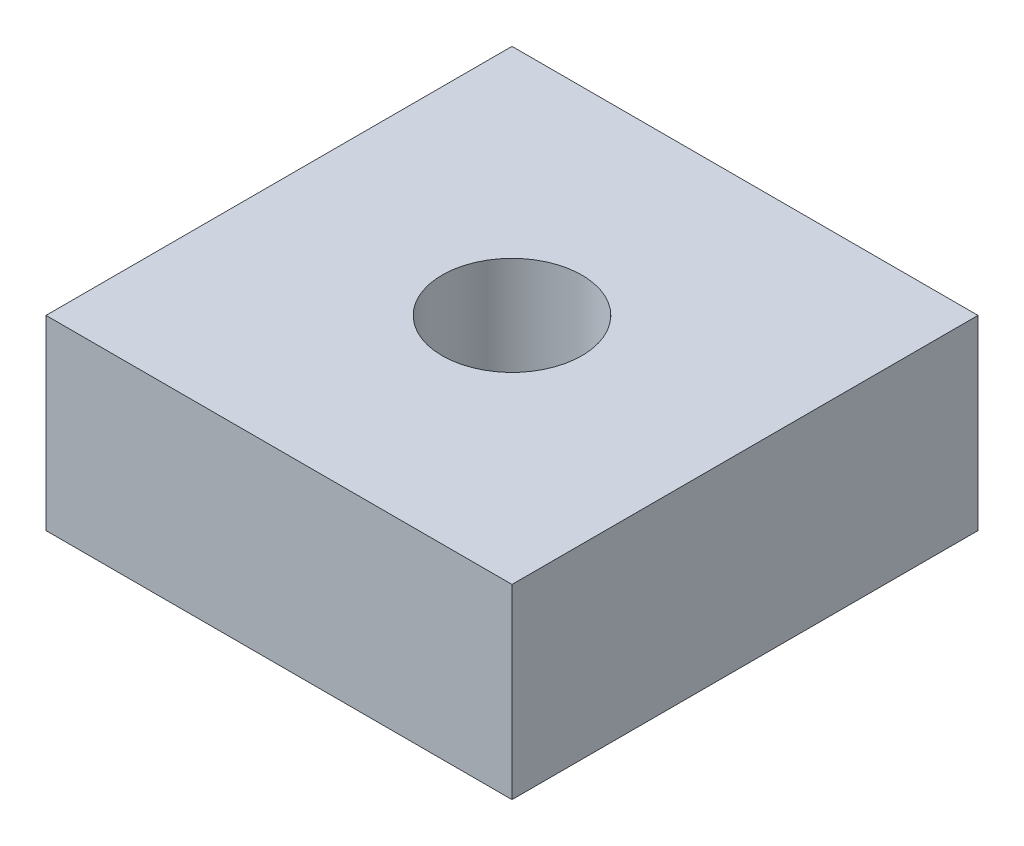
ISO-10303-21;
HEADER;
FILE_DESCRIPTION(('STEP AP214'),'2;1');
FILE_NAME('part.step','',(''),(''),'','','');
FILE_SCHEMA(('AUTOMOTIVE_DESIGN { 1 0 10303 214 1 1 1 1 }'));
ENDSEC;
DATA;
#1=APPLICATION_CONTEXT('core data for automotive mechanical design processes');
#2=APPLICATION_PROTOCOL_DEFINITION('international standard','automotive_design',2000,#1);
#3=PRODUCT_CONTEXT('',#1,'mechanical');
#4=PRODUCT('Part','Part','',(#3));
#5=PRODUCT_RELATED_PRODUCT_CATEGORY('part','',(#4));
#6=PRODUCT_DEFINITION_FORMATION('','',#4);
#7=PRODUCT_DEFINITION_CONTEXT('part definition',#1,'design');
#8=PRODUCT_DEFINITION('design','',#6,#7);
#9=PRODUCT_DEFINITION_SHAPE('','',#8);
#10=(LENGTH_UNIT() NAMED_UNIT(*) SI_UNIT(.MILLI.,.METRE.));
#11=(NAMED_UNIT(*) PLANE_ANGLE_UNIT() SI_UNIT($,.RADIAN.));
#12=(NAMED_UNIT(*) SI_UNIT($,.STERADIAN.) SOLID_ANGLE_UNIT());
#13=UNCERTAINTY_MEASURE_WITH_UNIT(LENGTH_MEASURE(1.E-05),#10,'distance_accuracy_value','');
#14=(GEOMETRIC_REPRESENTATION_CONTEXT(3) GLOBAL_UNCERTAINTY_ASSIGNED_CONTEXT((#13)) GLOBAL_UNIT_ASSIGNED_CONTEXT((#10,
#11,#12)) REPRESENTATION_CONTEXT('',''));
#15=CARTESIAN_POINT('',(0.,0.,0.));
#16=DIRECTION('',(0.,0.,1.));
#17=DIRECTION('',(1.,0.,0.));
#18=AXIS2_PLACEMENT_3D('',#15,#16,#17);
#19=CARTESIAN_POINT('',(0.,10.,0.));
#20=DIRECTION('',(0.,-1.,0.));
#21=DIRECTION('',(0.,0.,-1.));
#22=AXIS2_PLACEMENT_3D('',#19,#20,#21);
#23=PLANE('',#22);
#24=DIRECTION('',(0.,0.,-1.));
#25=VECTOR('',#24,1.);
#26=CARTESIAN_POINT('',(25.,10.,25.));
#27=LINE('',#26,#25);
#28=CARTESIAN_POINT('',(25.,10.,25.));
#29=VERTEX_POINT('',#28);
#30=CARTESIAN_POINT('',(25.,10.,-25.));
#31=VERTEX_POINT('',#30);
#32=EDGE_CURVE('E93',#29,#31,#27,.T.);
#33=ORIENTED_EDGE('',*,*,#32,.T.);
#34=DIRECTION('',(-1.,0.,0.));
#35=VECTOR('',#34,1.);
#36=CARTESIAN_POINT('',(-25.,10.,-25.));
#37=LINE('',#36,#35);
#38=CARTESIAN_POINT('',(-25.,10.,-25.));
#39=VERTEX_POINT('',#38);
#40=EDGE_CURVE('E88',#31,#39,#37,.T.);
#41=ORIENTED_EDGE('',*,*,#40,.T.);
#42=DIRECTION('',(0.,0.,1.));
#43=VECTOR('',#42,1.);
#44=CARTESIAN_POINT('',(-25.,10.,25.));
#45=LINE('',#44,#43);
#46=CARTESIAN_POINT('',(-25.,10.,25.));
#47=VERTEX_POINT('',#46);
#48=EDGE_CURVE('E91',#39,#47,#45,.T.);
#49=ORIENTED_EDGE('',*,*,#48,.T.);
#50=DIRECTION('',(1.,0.,0.));
#51=VECTOR('',#50,1.);
#52=CARTESIAN_POINT('',(-25.,10.,25.));
#53=LINE('',#52,#51);
#54=EDGE_CURVE('E58',#47,#29,#53,.T.);
#55=ORIENTED_EDGE('',*,*,#54,.T.);
#56=EDGE_LOOP('',(#33,#41,#49,#55));
#57=FACE_BOUND('',#56,.T.);
#58=CARTESIAN_POINT('',(0.,10.,0.));
#59=DIRECTION('',(0.,1.,0.));
#60=DIRECTION('',(0.,0.,1.));
#61=AXIS2_PLACEMENT_3D('',#58,#59,#60);
#62=CIRCLE('',#61,7.5);
#63=CARTESIAN_POINT('',(0.,10.,7.5));
#64=VERTEX_POINT('',#63);
#65=EDGE_CURVE('E108',#64,#64,#62,.T.);
#66=ORIENTED_EDGE('',*,*,#65,.F.);
#67=EDGE_LOOP('',(#66));
#68=FACE_BOUND('',#67,.T.);
#69=ADVANCED_FACE('F41',(#57,#68),#23,.F.);
#70=CARTESIAN_POINT('',(0.,-10.,0.));
#71=DIRECTION('',(0.,-1.,0.));
#72=DIRECTION('',(0.,0.,-1.));
#73=AXIS2_PLACEMENT_3D('',#70,#71,#72);
#74=PLANE('',#73);
#75=DIRECTION('',(0.,0.,-1.));
#76=VECTOR('',#75,1.);
#77=CARTESIAN_POINT('',(25.,-10.,25.));
#78=LINE('',#77,#76);
#79=CARTESIAN_POINT('',(25.,-10.,25.));
#80=VERTEX_POINT('',#79);
#81=CARTESIAN_POINT('',(25.,-10.,-25.));
#82=VERTEX_POINT('',#81);
#83=EDGE_CURVE('E105',#80,#82,#78,.T.);
#84=ORIENTED_EDGE('',*,*,#83,.F.);
#85=DIRECTION('',(1.,0.,0.));
#86=VECTOR('',#85,1.);
#87=CARTESIAN_POINT('',(-25.,-10.,25.));
#88=LINE('',#87,#86);
#89=CARTESIAN_POINT('',(-25.,-10.,25.));
#90=VERTEX_POINT('',#89);
#91=EDGE_CURVE('E81',#90,#80,#88,.T.);
#92=ORIENTED_EDGE('',*,*,#91,.F.);
#93=DIRECTION('',(0.,0.,1.));
#94=VECTOR('',#93,1.);
#95=CARTESIAN_POINT('',(-25.,-10.,25.));
#96=LINE('',#95,#94);
#97=CARTESIAN_POINT('',(-25.,-10.,-25.));
#98=VERTEX_POINT('',#97);
#99=EDGE_CURVE('E75',#98,#90,#96,.T.);
#100=ORIENTED_EDGE('',*,*,#99,.F.);
#101=DIRECTION('',(-1.,0.,0.));
#102=VECTOR('',#101,1.);
#103=CARTESIAN_POINT('',(-25.,-10.,-25.));
#104=LINE('',#103,#102);
#105=EDGE_CURVE('E97',#82,#98,#104,.T.);
#106=ORIENTED_EDGE('',*,*,#105,.F.);
#107=EDGE_LOOP('',(#84,#92,#100,#106));
#108=FACE_BOUND('',#107,.T.);
#109=CARTESIAN_POINT('',(0.,-10.,0.));
#110=DIRECTION('',(0.,1.,0.));
#111=DIRECTION('',(0.,0.,1.));
#112=AXIS2_PLACEMENT_3D('',#109,#110,#111);
#113=CIRCLE('',#112,7.5);
#114=CARTESIAN_POINT('',(0.,-10.,7.5));
#115=VERTEX_POINT('',#114);
#116=EDGE_CURVE('E120',#115,#115,#113,.T.);
#117=ORIENTED_EDGE('',*,*,#116,.T.);
#118=EDGE_LOOP('',(#117));
#119=FACE_BOUND('',#118,.T.);
#120=ADVANCED_FACE('F116',(#108,#119),#74,.T.);
#121=CARTESIAN_POINT('',(25.,10.,25.));
#122=DIRECTION('',(-1.,0.,0.));
#123=DIRECTION('',(0.,0.,1.));
#124=AXIS2_PLACEMENT_3D('',#121,#122,#123);
#125=PLANE('',#124);
#126=ORIENTED_EDGE('',*,*,#83,.T.);
#127=DIRECTION('',(0.,-1.,0.));
#128=VECTOR('',#127,1.);
#129=CARTESIAN_POINT('',(25.,10.,-25.));
#130=LINE('',#129,#128);
#131=EDGE_CURVE('E11',#31,#82,#130,.T.);
#132=ORIENTED_EDGE('',*,*,#131,.F.);
#133=ORIENTED_EDGE('',*,*,#32,.F.);
#134=DIRECTION('',(0.,-1.,0.));
#135=VECTOR('',#134,1.);
#136=CARTESIAN_POINT('',(25.,10.,25.));
#137=LINE('',#136,#135);
#138=EDGE_CURVE('E101',#29,#80,#137,.T.);
#139=ORIENTED_EDGE('',*,*,#138,.T.);
#140=EDGE_LOOP('',(#126,#132,#133,#139));
#141=FACE_BOUND('',#140,.T.);
#142=ADVANCED_FACE('F43',(#141),#125,.F.);
#143=CARTESIAN_POINT('',(-25.,10.,-25.));
#144=DIRECTION('',(0.,0.,1.));
#145=DIRECTION('',(1.,0.,0.));
#146=AXIS2_PLACEMENT_3D('',#143,#144,#145);
#147=PLANE('',#146);
#148=ORIENTED_EDGE('',*,*,#105,.T.);
#149=DIRECTION('',(0.,-1.,0.));
#150=VECTOR('',#149,1.);
#151=CARTESIAN_POINT('',(-25.,10.,-25.));
#152=LINE('',#151,#150);
#153=EDGE_CURVE('E50',#39,#98,#152,.T.);
#154=ORIENTED_EDGE('',*,*,#153,.F.);
#155=ORIENTED_EDGE('',*,*,#40,.F.);
#156=ORIENTED_EDGE('',*,*,#131,.T.);
#157=EDGE_LOOP('',(#148,#154,#155,#156));
#158=FACE_BOUND('',#157,.T.);
#159=ADVANCED_FACE('F96',(#158),#147,.F.);
#160=CARTESIAN_POINT('',(-25.,10.,25.));
#161=DIRECTION('',(1.,0.,0.));
#162=DIRECTION('',(0.,0.,-1.));
#163=AXIS2_PLACEMENT_3D('',#160,#161,#162);
#164=PLANE('',#163);
#165=ORIENTED_EDGE('',*,*,#99,.T.);
#166=DIRECTION('',(0.,-1.,0.));
#167=VECTOR('',#166,1.);
#168=CARTESIAN_POINT('',(-25.,10.,25.));
#169=LINE('',#168,#167);
#170=EDGE_CURVE('E98',#47,#90,#169,.T.);
#171=ORIENTED_EDGE('',*,*,#170,.F.);
#172=ORIENTED_EDGE('',*,*,#48,.F.);
#173=ORIENTED_EDGE('',*,*,#153,.T.);
#174=EDGE_LOOP('',(#165,#171,#172,#173));
#175=FACE_BOUND('',#174,.T.);
#176=ADVANCED_FACE('F99',(#175),#164,.F.);
#177=CARTESIAN_POINT('',(-25.,10.,25.));
#178=DIRECTION('',(0.,0.,-1.));
#179=DIRECTION('',(-1.,0.,0.));
#180=AXIS2_PLACEMENT_3D('',#177,#178,#179);
#181=PLANE('',#180);
#182=ORIENTED_EDGE('',*,*,#91,.T.);
#183=ORIENTED_EDGE('',*,*,#138,.F.);
#184=ORIENTED_EDGE('',*,*,#54,.F.);
#185=ORIENTED_EDGE('',*,*,#170,.T.);
#186=EDGE_LOOP('',(#182,#183,#184,#185));
#187=FACE_BOUND('',#186,.T.);
#188=ADVANCED_FACE('F113',(#187),#181,.F.);
#189=CARTESIAN_POINT('',(0.,10.,0.));
#190=DIRECTION('',(0.,-1.,0.));
#191=DIRECTION('',(0.,0.,-1.));
#192=AXIS2_PLACEMENT_3D('',#189,#190,#191);
#193=CYLINDRICAL_SURFACE('',#192,7.5);
#194=ORIENTED_EDGE('',*,*,#65,.T.);
#195=EDGE_LOOP('',(#194));
#196=FACE_BOUND('',#195,.T.);
#197=ORIENTED_EDGE('',*,*,#116,.F.);
#198=EDGE_LOOP('',(#197));
#199=FACE_BOUND('',#198,.T.);
#200=ADVANCED_FACE('F126',(#196,#199),#193,.F.);
#201=CLOSED_SHELL('',(#69,#120,#142,#159,#176,#188,#200));
#202=MANIFOLD_SOLID_BREP('B2',#201);
#203=ADVANCED_BREP_SHAPE_REPRESENTATION('',(#18,#202),#14);
#204=SHAPE_DEFINITION_REPRESENTATION(#9,#203);
ENDSEC;
END-ISO-10303-21;
